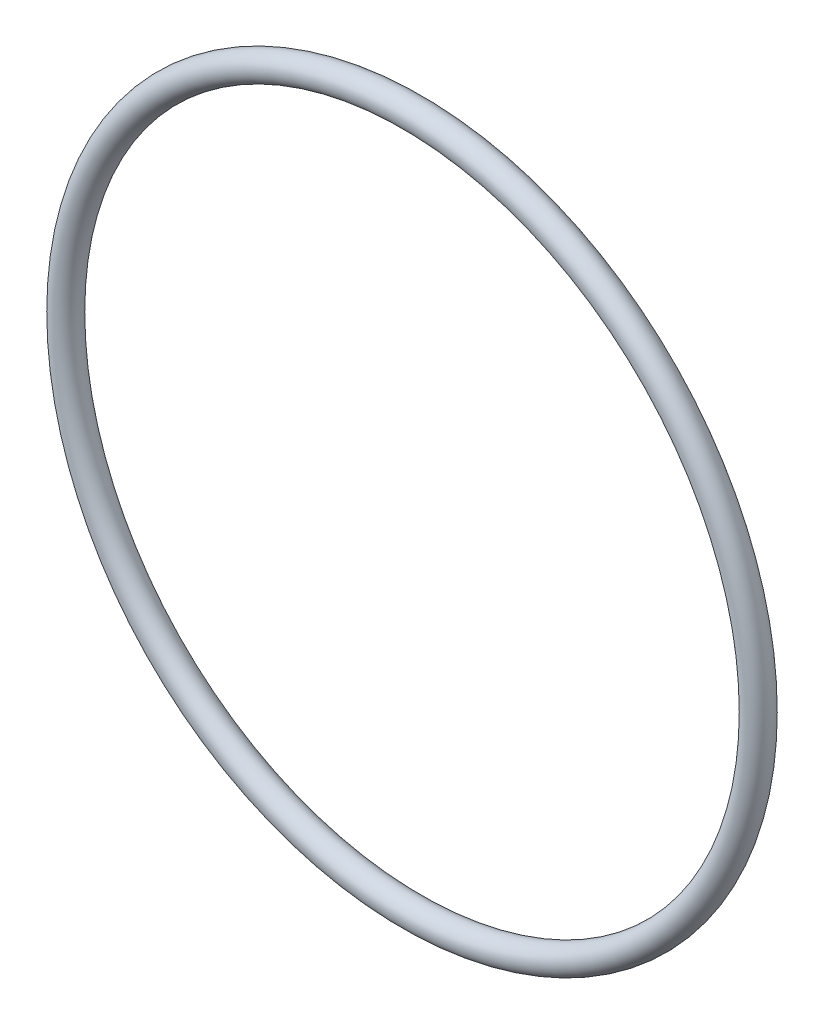
ISO-10303-21;
HEADER;
FILE_DESCRIPTION(('STEP AP214'),'2;1');
FILE_NAME('part.step','',(''),(''),'','','');
FILE_SCHEMA(('AUTOMOTIVE_DESIGN { 1 0 10303 214 1 1 1 1 }'));
ENDSEC;
DATA;
#1=APPLICATION_CONTEXT('core data for automotive mechanical design processes');
#2=APPLICATION_PROTOCOL_DEFINITION('international standard','automotive_design',2000,#1);
#3=PRODUCT_CONTEXT('',#1,'mechanical');
#4=PRODUCT('Part','Part','',(#3));
#5=PRODUCT_RELATED_PRODUCT_CATEGORY('part','',(#4));
#6=PRODUCT_DEFINITION_FORMATION('','',#4);
#7=PRODUCT_DEFINITION_CONTEXT('part definition',#1,'design');
#8=PRODUCT_DEFINITION('design','',#6,#7);
#9=PRODUCT_DEFINITION_SHAPE('','',#8);
#10=(LENGTH_UNIT() NAMED_UNIT(*) SI_UNIT(.MILLI.,.METRE.));
#11=(NAMED_UNIT(*) PLANE_ANGLE_UNIT() SI_UNIT($,.RADIAN.));
#12=(NAMED_UNIT(*) SI_UNIT($,.STERADIAN.) SOLID_ANGLE_UNIT());
#13=UNCERTAINTY_MEASURE_WITH_UNIT(LENGTH_MEASURE(1.E-05),#10,'distance_accuracy_value','');
#14=(GEOMETRIC_REPRESENTATION_CONTEXT(3) GLOBAL_UNCERTAINTY_ASSIGNED_CONTEXT((#13)) GLOBAL_UNIT_ASSIGNED_CONTEXT((#10,
#11,#12)) REPRESENTATION_CONTEXT('',''));
#15=CARTESIAN_POINT('',(0.,0.,0.));
#16=DIRECTION('',(0.,0.,1.));
#17=DIRECTION('',(1.,0.,0.));
#18=AXIS2_PLACEMENT_3D('',#15,#16,#17);
#19=CARTESIAN_POINT('',(0.,0.,0.));
#20=DIRECTION('',(0.,0.,1.));
#21=DIRECTION('',(1.,0.,0.));
#22=AXIS2_PLACEMENT_3D('',#19,#20,#21);
#23=TOROIDAL_SURFACE('',#22,33.6931,1.3081);
#24=CARTESIAN_POINT('',(35.0012,0.,0.));
#25=VERTEX_POINT('',#24);
#26=VERTEX_LOOP('',#25);
#27=FACE_BOUND('',#26,.T.);
#28=ADVANCED_FACE('F35',(#27),#23,.T.);
#29=CLOSED_SHELL('',(#28));
#30=MANIFOLD_SOLID_BREP('B2',#29);
#31=ADVANCED_BREP_SHAPE_REPRESENTATION('',(#18,#30),#14);
#32=SHAPE_DEFINITION_REPRESENTATION(#9,#31);
ENDSEC;
END-ISO-10303-21;
